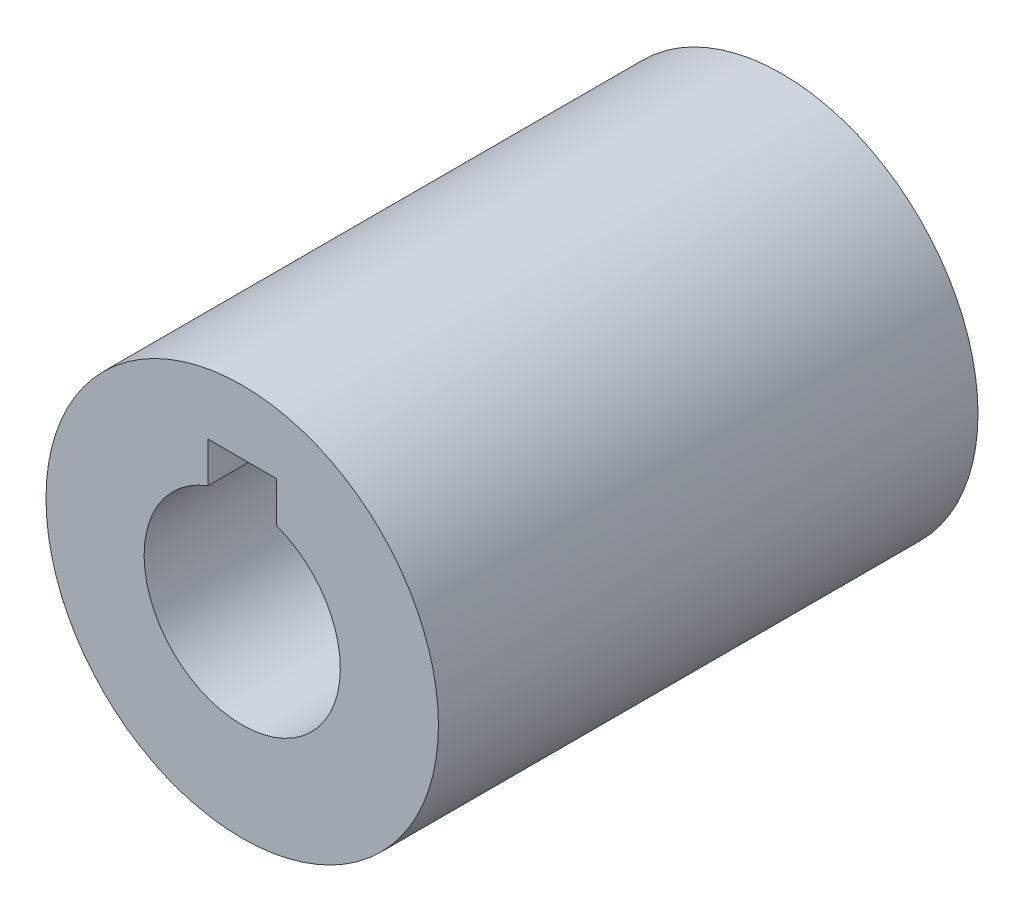
ISO-10303-21;
HEADER;
FILE_DESCRIPTION(('STEP AP214'),'2;1');
FILE_NAME('part.step','',(''),(''),'','','');
FILE_SCHEMA(('AUTOMOTIVE_DESIGN { 1 0 10303 214 1 1 1 1 }'));
ENDSEC;
DATA;
#1=APPLICATION_CONTEXT('core data for automotive mechanical design processes');
#2=APPLICATION_PROTOCOL_DEFINITION('international standard','automotive_design',2000,#1);
#3=PRODUCT_CONTEXT('',#1,'mechanical');
#4=PRODUCT('Part','Part','',(#3));
#5=PRODUCT_RELATED_PRODUCT_CATEGORY('part','',(#4));
#6=PRODUCT_DEFINITION_FORMATION('','',#4);
#7=PRODUCT_DEFINITION_CONTEXT('part definition',#1,'design');
#8=PRODUCT_DEFINITION('design','',#6,#7);
#9=PRODUCT_DEFINITION_SHAPE('','',#8);
#10=(LENGTH_UNIT() NAMED_UNIT(*) SI_UNIT(.MILLI.,.METRE.));
#11=(NAMED_UNIT(*) PLANE_ANGLE_UNIT() SI_UNIT($,.RADIAN.));
#12=(NAMED_UNIT(*) SI_UNIT($,.STERADIAN.) SOLID_ANGLE_UNIT());
#13=UNCERTAINTY_MEASURE_WITH_UNIT(LENGTH_MEASURE(1.E-05),#10,'distance_accuracy_value','');
#14=(GEOMETRIC_REPRESENTATION_CONTEXT(3) GLOBAL_UNCERTAINTY_ASSIGNED_CONTEXT((#13)) GLOBAL_UNIT_ASSIGNED_CONTEXT((#10,
#11,#12)) REPRESENTATION_CONTEXT('',''));
#15=CARTESIAN_POINT('',(0.,0.,0.));
#16=DIRECTION('',(0.,0.,1.));
#17=DIRECTION('',(1.,0.,0.));
#18=AXIS2_PLACEMENT_3D('',#15,#16,#17);
#19=CARTESIAN_POINT('',(0.,0.,55.));
#20=DIRECTION('',(0.,0.,-1.));
#21=DIRECTION('',(-1.,0.,0.));
#22=AXIS2_PLACEMENT_3D('',#19,#20,#21);
#23=CYLINDRICAL_SURFACE('',#22,10.);
#24=CARTESIAN_POINT('',(0.,0.,0.));
#25=DIRECTION('',(0.,0.,1.));
#26=DIRECTION('',(1.,0.,0.));
#27=AXIS2_PLACEMENT_3D('',#24,#25,#26);
#28=CIRCLE('',#27,10.);
#29=CARTESIAN_POINT('',(-3.5,9.3674969975976,0.));
#30=VERTEX_POINT('',#29);
#31=CARTESIAN_POINT('',(3.5,9.3674969975976,0.));
#32=VERTEX_POINT('',#31);
#33=EDGE_CURVE('E112',#30,#32,#28,.T.);
#34=ORIENTED_EDGE('',*,*,#33,.F.);
#35=DIRECTION('',(0.,0.,-1.));
#36=VECTOR('',#35,1.);
#37=CARTESIAN_POINT('',(-3.5,9.3674969975976,55.));
#38=LINE('',#37,#36);
#39=CARTESIAN_POINT('',(-3.5,9.3674969975976,55.));
#40=VERTEX_POINT('',#39);
#41=EDGE_CURVE('E13',#40,#30,#38,.T.);
#42=ORIENTED_EDGE('',*,*,#41,.F.);
#43=CARTESIAN_POINT('',(0.,0.,55.));
#44=DIRECTION('',(0.,0.,1.));
#45=DIRECTION('',(1.,0.,0.));
#46=AXIS2_PLACEMENT_3D('',#43,#44,#45);
#47=CIRCLE('',#46,10.);
#48=CARTESIAN_POINT('',(3.5,9.3674969975976,55.));
#49=VERTEX_POINT('',#48);
#50=EDGE_CURVE('E94',#40,#49,#47,.T.);
#51=ORIENTED_EDGE('',*,*,#50,.T.);
#52=DIRECTION('',(0.,0.,-1.));
#53=VECTOR('',#52,1.);
#54=CARTESIAN_POINT('',(3.5,9.3674969975976,55.));
#55=LINE('',#54,#53);
#56=EDGE_CURVE('E61',#49,#32,#55,.T.);
#57=ORIENTED_EDGE('',*,*,#56,.T.);
#58=EDGE_LOOP('',(#34,#42,#51,#57));
#59=FACE_BOUND('',#58,.T.);
#60=ADVANCED_FACE('F45',(#59),#23,.F.);
#61=CARTESIAN_POINT('',(-3.5,0.,55.));
#62=DIRECTION('',(-1.,0.,0.));
#63=DIRECTION('',(0.,0.,1.));
#64=AXIS2_PLACEMENT_3D('',#61,#62,#63);
#65=PLANE('',#64);
#66=DIRECTION('',(0.,1.,0.));
#67=VECTOR('',#66,1.);
#68=CARTESIAN_POINT('',(-3.5,0.,0.));
#69=LINE('',#68,#67);
#70=CARTESIAN_POINT('',(-3.5,13.5,0.));
#71=VERTEX_POINT('',#70);
#72=EDGE_CURVE('E100',#30,#71,#69,.T.);
#73=ORIENTED_EDGE('',*,*,#72,.T.);
#74=DIRECTION('',(0.,0.,-1.));
#75=VECTOR('',#74,1.);
#76=CARTESIAN_POINT('',(-3.5,13.5,55.));
#77=LINE('',#76,#75);
#78=CARTESIAN_POINT('',(-3.5,13.5,55.));
#79=VERTEX_POINT('',#78);
#80=EDGE_CURVE('E53',#79,#71,#77,.T.);
#81=ORIENTED_EDGE('',*,*,#80,.F.);
#82=DIRECTION('',(0.,1.,0.));
#83=VECTOR('',#82,1.);
#84=CARTESIAN_POINT('',(-3.5,0.,55.));
#85=LINE('',#84,#83);
#86=EDGE_CURVE('E87',#40,#79,#85,.T.);
#87=ORIENTED_EDGE('',*,*,#86,.F.);
#88=ORIENTED_EDGE('',*,*,#41,.T.);
#89=EDGE_LOOP('',(#73,#81,#87,#88));
#90=FACE_BOUND('',#89,.T.);
#91=ADVANCED_FACE('F98',(#90),#65,.F.);
#92=CARTESIAN_POINT('',(0.,13.5,55.));
#93=DIRECTION('',(0.,1.,0.));
#94=DIRECTION('',(0.,0.,1.));
#95=AXIS2_PLACEMENT_3D('',#92,#93,#94);
#96=PLANE('',#95);
#97=DIRECTION('',(1.,0.,0.));
#98=VECTOR('',#97,1.);
#99=CARTESIAN_POINT('',(0.,13.5,0.));
#100=LINE('',#99,#98);
#101=CARTESIAN_POINT('',(3.5,13.5,0.));
#102=VERTEX_POINT('',#101);
#103=EDGE_CURVE('E115',#71,#102,#100,.T.);
#104=ORIENTED_EDGE('',*,*,#103,.T.);
#105=DIRECTION('',(0.,0.,-1.));
#106=VECTOR('',#105,1.);
#107=CARTESIAN_POINT('',(3.5,13.5,55.));
#108=LINE('',#107,#106);
#109=CARTESIAN_POINT('',(3.5,13.5,55.));
#110=VERTEX_POINT('',#109);
#111=EDGE_CURVE('E75',#110,#102,#108,.T.);
#112=ORIENTED_EDGE('',*,*,#111,.F.);
#113=DIRECTION('',(1.,0.,0.));
#114=VECTOR('',#113,1.);
#115=CARTESIAN_POINT('',(0.,13.5,55.));
#116=LINE('',#115,#114);
#117=EDGE_CURVE('E93',#79,#110,#116,.T.);
#118=ORIENTED_EDGE('',*,*,#117,.F.);
#119=ORIENTED_EDGE('',*,*,#80,.T.);
#120=EDGE_LOOP('',(#104,#112,#118,#119));
#121=FACE_BOUND('',#120,.T.);
#122=ADVANCED_FACE('F103',(#121),#96,.F.);
#123=CARTESIAN_POINT('',(3.5,0.,55.));
#124=DIRECTION('',(-1.,0.,0.));
#125=DIRECTION('',(0.,0.,1.));
#126=AXIS2_PLACEMENT_3D('',#123,#124,#125);
#127=PLANE('',#126);
#128=DIRECTION('',(0.,1.,0.));
#129=VECTOR('',#128,1.);
#130=CARTESIAN_POINT('',(3.5,0.,0.));
#131=LINE('',#130,#129);
#132=EDGE_CURVE('E117',#32,#102,#131,.T.);
#133=ORIENTED_EDGE('',*,*,#132,.F.);
#134=ORIENTED_EDGE('',*,*,#56,.F.);
#135=DIRECTION('',(0.,1.,0.));
#136=VECTOR('',#135,1.);
#137=CARTESIAN_POINT('',(3.5,0.,55.));
#138=LINE('',#137,#136);
#139=EDGE_CURVE('E104',#49,#110,#138,.T.);
#140=ORIENTED_EDGE('',*,*,#139,.T.);
#141=ORIENTED_EDGE('',*,*,#111,.T.);
#142=EDGE_LOOP('',(#133,#134,#140,#141));
#143=FACE_BOUND('',#142,.T.);
#144=ADVANCED_FACE('F126',(#143),#127,.T.);
#145=CARTESIAN_POINT('',(0.,0.,55.));
#146=DIRECTION('',(0.,0.,-1.));
#147=DIRECTION('',(-1.,0.,0.));
#148=AXIS2_PLACEMENT_3D('',#145,#146,#147);
#149=CYLINDRICAL_SURFACE('',#148,20.);
#150=CARTESIAN_POINT('',(0.,0.,55.));
#151=DIRECTION('',(0.,0.,1.));
#152=DIRECTION('',(1.,0.,0.));
#153=AXIS2_PLACEMENT_3D('',#150,#151,#152);
#154=CIRCLE('',#153,20.);
#155=CARTESIAN_POINT('',(20.,0.,55.));
#156=VERTEX_POINT('',#155);
#157=EDGE_CURVE('E106',#156,#156,#154,.T.);
#158=ORIENTED_EDGE('',*,*,#157,.F.);
#159=EDGE_LOOP('',(#158));
#160=FACE_BOUND('',#159,.T.);
#161=CARTESIAN_POINT('',(0.,0.,0.));
#162=DIRECTION('',(0.,0.,1.));
#163=DIRECTION('',(1.,0.,0.));
#164=AXIS2_PLACEMENT_3D('',#161,#162,#163);
#165=CIRCLE('',#164,20.);
#166=CARTESIAN_POINT('',(20.,0.,0.));
#167=VERTEX_POINT('',#166);
#168=EDGE_CURVE('E120',#167,#167,#165,.T.);
#169=ORIENTED_EDGE('',*,*,#168,.T.);
#170=EDGE_LOOP('',(#169));
#171=FACE_BOUND('',#170,.T.);
#172=ADVANCED_FACE('F128',(#160,#171),#149,.T.);
#173=CARTESIAN_POINT('',(0.,0.,55.));
#174=DIRECTION('',(0.,0.,1.));
#175=DIRECTION('',(1.,0.,0.));
#176=AXIS2_PLACEMENT_3D('',#173,#174,#175);
#177=PLANE('',#176);
#178=ORIENTED_EDGE('',*,*,#50,.F.);
#179=ORIENTED_EDGE('',*,*,#86,.T.);
#180=ORIENTED_EDGE('',*,*,#117,.T.);
#181=ORIENTED_EDGE('',*,*,#139,.F.);
#182=EDGE_LOOP('',(#178,#179,#180,#181));
#183=FACE_BOUND('',#182,.T.);
#184=ORIENTED_EDGE('',*,*,#157,.T.);
#185=EDGE_LOOP('',(#184));
#186=FACE_BOUND('',#185,.T.);
#187=ADVANCED_FACE('F89',(#183,#186),#177,.T.);
#188=CARTESIAN_POINT('',(0.,0.,0.));
#189=DIRECTION('',(0.,0.,1.));
#190=DIRECTION('',(1.,0.,0.));
#191=AXIS2_PLACEMENT_3D('',#188,#189,#190);
#192=PLANE('',#191);
#193=ORIENTED_EDGE('',*,*,#33,.T.);
#194=ORIENTED_EDGE('',*,*,#132,.T.);
#195=ORIENTED_EDGE('',*,*,#103,.F.);
#196=ORIENTED_EDGE('',*,*,#72,.F.);
#197=EDGE_LOOP('',(#193,#194,#195,#196));
#198=FACE_BOUND('',#197,.T.);
#199=ORIENTED_EDGE('',*,*,#168,.F.);
#200=EDGE_LOOP('',(#199));
#201=FACE_BOUND('',#200,.T.);
#202=ADVANCED_FACE('F166',(#198,#201),#192,.F.);
#203=CLOSED_SHELL('',(#60,#91,#122,#144,#172,#187,#202));
#204=MANIFOLD_SOLID_BREP('B2',#203);
#205=ADVANCED_BREP_SHAPE_REPRESENTATION('',(#18,#204),#14);
#206=SHAPE_DEFINITION_REPRESENTATION(#9,#205);
ENDSEC;
END-ISO-10303-21;
